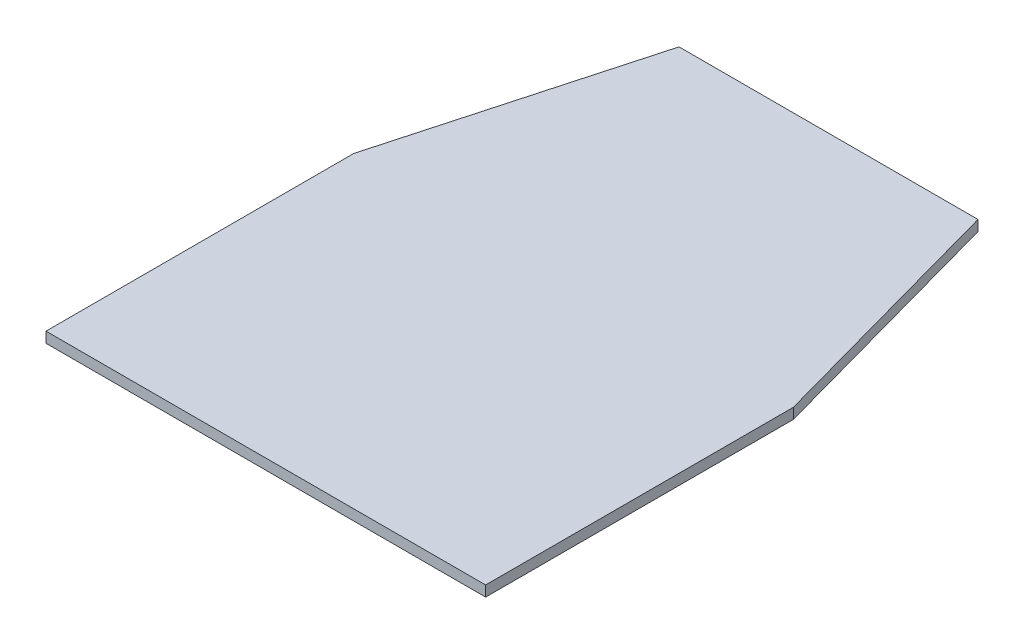
ISO-10303-21;
HEADER;
FILE_DESCRIPTION(('STEP AP214'),'2;1');
FILE_NAME('part.step','',(''),(''),'','','');
FILE_SCHEMA(('AUTOMOTIVE_DESIGN { 1 0 10303 214 1 1 1 1 }'));
ENDSEC;
DATA;
#1=APPLICATION_CONTEXT('core data for automotive mechanical design processes');
#2=APPLICATION_PROTOCOL_DEFINITION('international standard','automotive_design',2000,#1);
#3=PRODUCT_CONTEXT('',#1,'mechanical');
#4=PRODUCT('Part','Part','',(#3));
#5=PRODUCT_RELATED_PRODUCT_CATEGORY('part','',(#4));
#6=PRODUCT_DEFINITION_FORMATION('','',#4);
#7=PRODUCT_DEFINITION_CONTEXT('part definition',#1,'design');
#8=PRODUCT_DEFINITION('design','',#6,#7);
#9=PRODUCT_DEFINITION_SHAPE('','',#8);
#10=(LENGTH_UNIT() NAMED_UNIT(*) SI_UNIT(.MILLI.,.METRE.));
#11=(NAMED_UNIT(*) PLANE_ANGLE_UNIT() SI_UNIT($,.RADIAN.));
#12=(NAMED_UNIT(*) SI_UNIT($,.STERADIAN.) SOLID_ANGLE_UNIT());
#13=UNCERTAINTY_MEASURE_WITH_UNIT(LENGTH_MEASURE(1.E-05),#10,'distance_accuracy_value','');
#14=(GEOMETRIC_REPRESENTATION_CONTEXT(3) GLOBAL_UNCERTAINTY_ASSIGNED_CONTEXT((#13)) GLOBAL_UNIT_ASSIGNED_CONTEXT((#10,
#11,#12)) REPRESENTATION_CONTEXT('',''));
#15=CARTESIAN_POINT('',(0.,0.,0.));
#16=DIRECTION('',(0.,0.,1.));
#17=DIRECTION('',(1.,0.,0.));
#18=AXIS2_PLACEMENT_3D('',#15,#16,#17);
#19=CARTESIAN_POINT('',(250.,6.,0.));
#20=DIRECTION('',(-1.,0.,0.));
#21=DIRECTION('',(0.,0.,1.));
#22=AXIS2_PLACEMENT_3D('',#19,#20,#21);
#23=PLANE('',#22);
#24=DIRECTION('',(0.,0.,-1.));
#25=VECTOR('',#24,1.);
#26=CARTESIAN_POINT('',(250.,0.,0.));
#27=LINE('',#26,#25);
#28=CARTESIAN_POINT('',(250.,0.,0.));
#29=VERTEX_POINT('',#28);
#30=CARTESIAN_POINT('',(250.,0.,-175.));
#31=VERTEX_POINT('',#30);
#32=EDGE_CURVE('E130',#29,#31,#27,.T.);
#33=ORIENTED_EDGE('',*,*,#32,.T.);
#34=DIRECTION('',(0.,-1.,0.));
#35=VECTOR('',#34,1.);
#36=CARTESIAN_POINT('',(250.,6.,-175.));
#37=LINE('',#36,#35);
#38=CARTESIAN_POINT('',(250.,6.,-175.));
#39=VERTEX_POINT('',#38);
#40=EDGE_CURVE('E11',#39,#31,#37,.T.);
#41=ORIENTED_EDGE('',*,*,#40,.F.);
#42=DIRECTION('',(0.,0.,-1.));
#43=VECTOR('',#42,1.);
#44=CARTESIAN_POINT('',(250.,6.,0.));
#45=LINE('',#44,#43);
#46=CARTESIAN_POINT('',(250.,6.,0.));
#47=VERTEX_POINT('',#46);
#48=EDGE_CURVE('E149',#47,#39,#45,.T.);
#49=ORIENTED_EDGE('',*,*,#48,.F.);
#50=DIRECTION('',(0.,-1.,0.));
#51=VECTOR('',#50,1.);
#52=CARTESIAN_POINT('',(250.,6.,0.));
#53=LINE('',#52,#51);
#54=EDGE_CURVE('E126',#47,#29,#53,.T.);
#55=ORIENTED_EDGE('',*,*,#54,.T.);
#56=EDGE_LOOP('',(#33,#41,#49,#55));
#57=FACE_BOUND('',#56,.T.);
#58=ADVANCED_FACE('F43',(#57),#23,.F.);
#59=CARTESIAN_POINT('',(250.,6.,-175.));
#60=DIRECTION('',(-0.963992618206074,0.,0.265928998125813));
#61=DIRECTION('',(0.265928998125813,0.,0.963992618206074));
#62=AXIS2_PLACEMENT_3D('',#59,#60,#61);
#63=PLANE('',#62);
#64=DIRECTION('',(-0.265928998125813,0.,-0.963992618206074));
#65=VECTOR('',#64,1.);
#66=CARTESIAN_POINT('',(250.,0.,-175.));
#67=LINE('',#66,#65);
#68=CARTESIAN_POINT('',(210.,0.,-320.));
#69=VERTEX_POINT('',#68);
#70=EDGE_CURVE('E134',#31,#69,#67,.T.);
#71=ORIENTED_EDGE('',*,*,#70,.T.);
#72=DIRECTION('',(0.,-1.,0.));
#73=VECTOR('',#72,1.);
#74=CARTESIAN_POINT('',(210.,6.,-320.));
#75=LINE('',#74,#73);
#76=CARTESIAN_POINT('',(210.,6.,-320.));
#77=VERTEX_POINT('',#76);
#78=EDGE_CURVE('E52',#77,#69,#75,.T.);
#79=ORIENTED_EDGE('',*,*,#78,.F.);
#80=DIRECTION('',(-0.265928998125813,0.,-0.963992618206074));
#81=VECTOR('',#80,1.);
#82=CARTESIAN_POINT('',(250.,6.,-175.));
#83=LINE('',#82,#81);
#84=EDGE_CURVE('E93',#39,#77,#83,.T.);
#85=ORIENTED_EDGE('',*,*,#84,.F.);
#86=ORIENTED_EDGE('',*,*,#40,.T.);
#87=EDGE_LOOP('',(#71,#79,#85,#86));
#88=FACE_BOUND('',#87,.T.);
#89=ADVANCED_FACE('F159',(#88),#63,.F.);
#90=CARTESIAN_POINT('',(40.,6.,-320.));
#91=DIRECTION('',(0.,0.,-1.));
#92=DIRECTION('',(-1.,0.,0.));
#93=AXIS2_PLACEMENT_3D('',#90,#91,#92);
#94=PLANE('',#93);
#95=DIRECTION('',(1.,0.,0.));
#96=VECTOR('',#95,1.);
#97=CARTESIAN_POINT('',(40.,0.,-320.));
#98=LINE('',#97,#96);
#99=CARTESIAN_POINT('',(40.,0.,-320.));
#100=VERTEX_POINT('',#99);
#101=EDGE_CURVE('E138',#100,#69,#98,.T.);
#102=ORIENTED_EDGE('',*,*,#101,.F.);
#103=DIRECTION('',(0.,-1.,0.));
#104=VECTOR('',#103,1.);
#105=CARTESIAN_POINT('',(40.,6.,-320.));
#106=LINE('',#105,#104);
#107=CARTESIAN_POINT('',(40.,6.,-320.));
#108=VERTEX_POINT('',#107);
#109=EDGE_CURVE('E113',#108,#100,#106,.T.);
#110=ORIENTED_EDGE('',*,*,#109,.F.);
#111=DIRECTION('',(1.,0.,0.));
#112=VECTOR('',#111,1.);
#113=CARTESIAN_POINT('',(40.,6.,-320.));
#114=LINE('',#113,#112);
#115=EDGE_CURVE('E119',#108,#77,#114,.T.);
#116=ORIENTED_EDGE('',*,*,#115,.T.);
#117=ORIENTED_EDGE('',*,*,#78,.T.);
#118=EDGE_LOOP('',(#102,#110,#116,#117));
#119=FACE_BOUND('',#118,.T.);
#120=ADVANCED_FACE('F158',(#119),#94,.T.);
#121=CARTESIAN_POINT('',(0.,6.,-175.));
#122=DIRECTION('',(-0.963992618206074,0.,-0.265928998125813));
#123=DIRECTION('',(-0.265928998125813,0.,0.963992618206074));
#124=AXIS2_PLACEMENT_3D('',#121,#122,#123);
#125=PLANE('',#124);
#126=DIRECTION('',(0.265928998125813,0.,-0.963992618206074));
#127=VECTOR('',#126,1.);
#128=CARTESIAN_POINT('',(0.,0.,-175.));
#129=LINE('',#128,#127);
#130=CARTESIAN_POINT('',(0.,0.,-175.));
#131=VERTEX_POINT('',#130);
#132=EDGE_CURVE('E107',#131,#100,#129,.T.);
#133=ORIENTED_EDGE('',*,*,#132,.F.);
#134=DIRECTION('',(0.,-1.,0.));
#135=VECTOR('',#134,1.);
#136=CARTESIAN_POINT('',(0.,6.,-175.));
#137=LINE('',#136,#135);
#138=CARTESIAN_POINT('',(0.,6.,-175.));
#139=VERTEX_POINT('',#138);
#140=EDGE_CURVE('E102',#139,#131,#137,.T.);
#141=ORIENTED_EDGE('',*,*,#140,.F.);
#142=DIRECTION('',(0.265928998125813,0.,-0.963992618206074));
#143=VECTOR('',#142,1.);
#144=CARTESIAN_POINT('',(0.,6.,-175.));
#145=LINE('',#144,#143);
#146=EDGE_CURVE('E105',#139,#108,#145,.T.);
#147=ORIENTED_EDGE('',*,*,#146,.T.);
#148=ORIENTED_EDGE('',*,*,#109,.T.);
#149=EDGE_LOOP('',(#133,#141,#147,#148));
#150=FACE_BOUND('',#149,.T.);
#151=ADVANCED_FACE('F104',(#150),#125,.T.);
#152=CARTESIAN_POINT('',(0.,6.,0.));
#153=DIRECTION('',(-1.,0.,0.));
#154=DIRECTION('',(0.,0.,1.));
#155=AXIS2_PLACEMENT_3D('',#152,#153,#154);
#156=PLANE('',#155);
#157=DIRECTION('',(0.,0.,-1.));
#158=VECTOR('',#157,1.);
#159=CARTESIAN_POINT('',(0.,0.,0.));
#160=LINE('',#159,#158);
#161=CARTESIAN_POINT('',(0.,0.,0.));
#162=VERTEX_POINT('',#161);
#163=EDGE_CURVE('E144',#162,#131,#160,.T.);
#164=ORIENTED_EDGE('',*,*,#163,.F.);
#165=DIRECTION('',(0.,-1.,0.));
#166=VECTOR('',#165,1.);
#167=CARTESIAN_POINT('',(0.,6.,0.));
#168=LINE('',#167,#166);
#169=CARTESIAN_POINT('',(0.,6.,0.));
#170=VERTEX_POINT('',#169);
#171=EDGE_CURVE('E82',#170,#162,#168,.T.);
#172=ORIENTED_EDGE('',*,*,#171,.F.);
#173=DIRECTION('',(0.,0.,-1.));
#174=VECTOR('',#173,1.);
#175=CARTESIAN_POINT('',(0.,6.,0.));
#176=LINE('',#175,#174);
#177=EDGE_CURVE('E117',#170,#139,#176,.T.);
#178=ORIENTED_EDGE('',*,*,#177,.T.);
#179=ORIENTED_EDGE('',*,*,#140,.T.);
#180=EDGE_LOOP('',(#164,#172,#178,#179));
#181=FACE_BOUND('',#180,.T.);
#182=ADVANCED_FACE('F122',(#181),#156,.T.);
#183=CARTESIAN_POINT('',(0.,6.,0.));
#184=DIRECTION('',(0.,0.,-1.));
#185=DIRECTION('',(-1.,0.,0.));
#186=AXIS2_PLACEMENT_3D('',#183,#184,#185);
#187=PLANE('',#186);
#188=DIRECTION('',(1.,0.,0.));
#189=VECTOR('',#188,1.);
#190=CARTESIAN_POINT('',(0.,0.,0.));
#191=LINE('',#190,#189);
#192=EDGE_CURVE('E85',#162,#29,#191,.T.);
#193=ORIENTED_EDGE('',*,*,#192,.T.);
#194=ORIENTED_EDGE('',*,*,#54,.F.);
#195=DIRECTION('',(1.,0.,0.));
#196=VECTOR('',#195,1.);
#197=CARTESIAN_POINT('',(0.,6.,0.));
#198=LINE('',#197,#196);
#199=EDGE_CURVE('E60',#170,#47,#198,.T.);
#200=ORIENTED_EDGE('',*,*,#199,.F.);
#201=ORIENTED_EDGE('',*,*,#171,.T.);
#202=EDGE_LOOP('',(#193,#194,#200,#201));
#203=FACE_BOUND('',#202,.T.);
#204=ADVANCED_FACE('F166',(#203),#187,.F.);
#205=CARTESIAN_POINT('',(0.,6.,0.));
#206=DIRECTION('',(0.,-1.,0.));
#207=DIRECTION('',(0.,0.,-1.));
#208=AXIS2_PLACEMENT_3D('',#205,#206,#207);
#209=PLANE('',#208);
#210=ORIENTED_EDGE('',*,*,#48,.T.);
#211=ORIENTED_EDGE('',*,*,#84,.T.);
#212=ORIENTED_EDGE('',*,*,#115,.F.);
#213=ORIENTED_EDGE('',*,*,#146,.F.);
#214=ORIENTED_EDGE('',*,*,#177,.F.);
#215=ORIENTED_EDGE('',*,*,#199,.T.);
#216=EDGE_LOOP('',(#210,#211,#212,#213,#214,#215));
#217=FACE_BOUND('',#216,.T.);
#218=ADVANCED_FACE('F116',(#217),#209,.F.);
#219=CARTESIAN_POINT('',(0.,0.,0.));
#220=DIRECTION('',(0.,-1.,0.));
#221=DIRECTION('',(0.,0.,-1.));
#222=AXIS2_PLACEMENT_3D('',#219,#220,#221);
#223=PLANE('',#222);
#224=ORIENTED_EDGE('',*,*,#32,.F.);
#225=ORIENTED_EDGE('',*,*,#192,.F.);
#226=ORIENTED_EDGE('',*,*,#163,.T.);
#227=ORIENTED_EDGE('',*,*,#132,.T.);
#228=ORIENTED_EDGE('',*,*,#101,.T.);
#229=ORIENTED_EDGE('',*,*,#70,.F.);
#230=EDGE_LOOP('',(#224,#225,#226,#227,#228,#229));
#231=FACE_BOUND('',#230,.T.);
#232=ADVANCED_FACE('F163',(#231),#223,.T.);
#233=CLOSED_SHELL('',(#58,#89,#120,#151,#182,#204,#218,#232));
#234=MANIFOLD_SOLID_BREP('B2',#233);
#235=ADVANCED_BREP_SHAPE_REPRESENTATION('',(#18,#234),#14);
#236=SHAPE_DEFINITION_REPRESENTATION(#9,#235);
ENDSEC;
END-ISO-10303-21;
